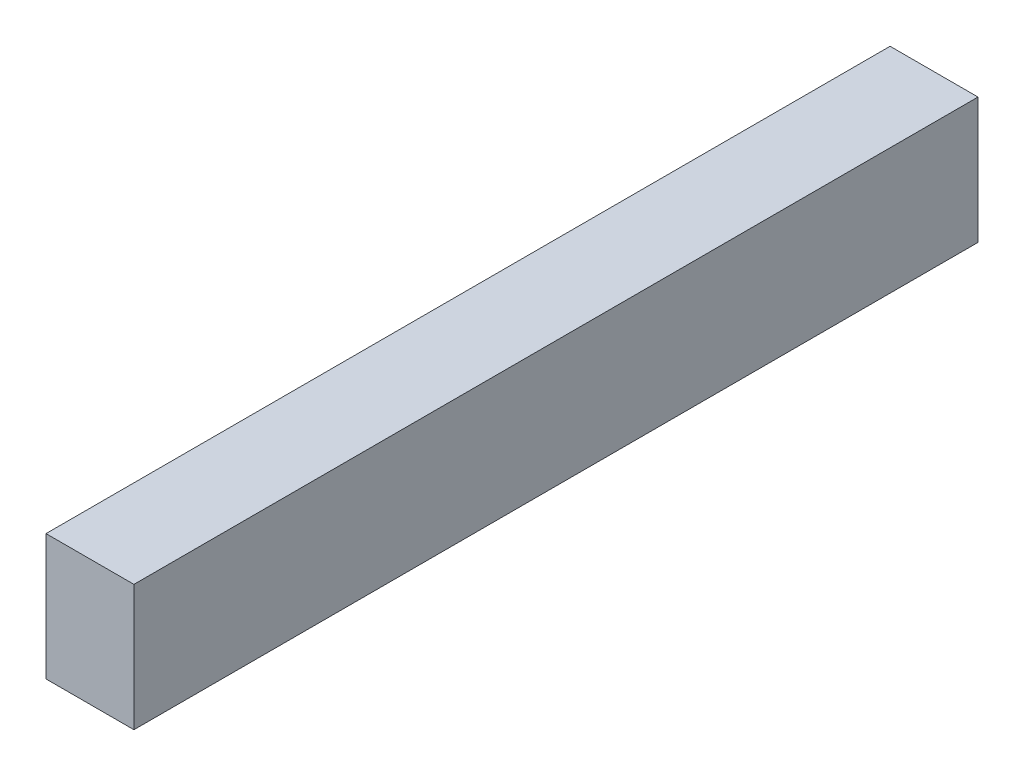
ISO-10303-21;
HEADER;
FILE_DESCRIPTION(('STEP AP214'),'2;1');
FILE_NAME('part.step','',(''),(''),'','','');
FILE_SCHEMA(('AUTOMOTIVE_DESIGN { 1 0 10303 214 1 1 1 1 }'));
ENDSEC;
DATA;
#1=APPLICATION_CONTEXT('core data for automotive mechanical design processes');
#2=APPLICATION_PROTOCOL_DEFINITION('international standard','automotive_design',2000,#1);
#3=PRODUCT_CONTEXT('',#1,'mechanical');
#4=PRODUCT('Part','Part','',(#3));
#5=PRODUCT_RELATED_PRODUCT_CATEGORY('part','',(#4));
#6=PRODUCT_DEFINITION_FORMATION('','',#4);
#7=PRODUCT_DEFINITION_CONTEXT('part definition',#1,'design');
#8=PRODUCT_DEFINITION('design','',#6,#7);
#9=PRODUCT_DEFINITION_SHAPE('','',#8);
#10=(LENGTH_UNIT() NAMED_UNIT(*) SI_UNIT(.MILLI.,.METRE.));
#11=(NAMED_UNIT(*) PLANE_ANGLE_UNIT() SI_UNIT($,.RADIAN.));
#12=(NAMED_UNIT(*) SI_UNIT($,.STERADIAN.) SOLID_ANGLE_UNIT());
#13=UNCERTAINTY_MEASURE_WITH_UNIT(LENGTH_MEASURE(1.E-05),#10,'distance_accuracy_value','');
#14=(GEOMETRIC_REPRESENTATION_CONTEXT(3) GLOBAL_UNCERTAINTY_ASSIGNED_CONTEXT((#13)) GLOBAL_UNIT_ASSIGNED_CONTEXT((#10,
#11,#12)) REPRESENTATION_CONTEXT('',''));
#15=CARTESIAN_POINT('',(0.,0.,0.));
#16=DIRECTION('',(0.,0.,1.));
#17=DIRECTION('',(1.,0.,0.));
#18=AXIS2_PLACEMENT_3D('',#15,#16,#17);
#19=CARTESIAN_POINT('',(-1.58749999999999,-2.2733,15.24));
#20=DIRECTION('',(1.,0.,0.));
#21=DIRECTION('',(0.,0.,-1.));
#22=AXIS2_PLACEMENT_3D('',#19,#20,#21);
#23=PLANE('',#22);
#24=DIRECTION('',(0.,-1.,0.));
#25=VECTOR('',#24,1.);
#26=CARTESIAN_POINT('',(-1.58749999999999,-2.2733,-15.24));
#27=LINE('',#26,#25);
#28=CARTESIAN_POINT('',(-1.58749999999999,2.2733,-15.24));
#29=VERTEX_POINT('',#28);
#30=CARTESIAN_POINT('',(-1.58749999999999,-2.2733,-15.24));
#31=VERTEX_POINT('',#30);
#32=EDGE_CURVE('E95',#29,#31,#27,.T.);
#33=ORIENTED_EDGE('',*,*,#32,.T.);
#34=DIRECTION('',(0.,0.,-1.));
#35=VECTOR('',#34,1.);
#36=CARTESIAN_POINT('',(-1.58749999999999,-2.2733,15.24));
#37=LINE('',#36,#35);
#38=CARTESIAN_POINT('',(-1.58749999999999,-2.2733,15.24));
#39=VERTEX_POINT('',#38);
#40=EDGE_CURVE('E11',#39,#31,#37,.T.);
#41=ORIENTED_EDGE('',*,*,#40,.F.);
#42=DIRECTION('',(0.,-1.,0.));
#43=VECTOR('',#42,1.);
#44=CARTESIAN_POINT('',(-1.58749999999999,-2.2733,15.24));
#45=LINE('',#44,#43);
#46=CARTESIAN_POINT('',(-1.58749999999999,2.2733,15.24));
#47=VERTEX_POINT('',#46);
#48=EDGE_CURVE('E83',#47,#39,#45,.T.);
#49=ORIENTED_EDGE('',*,*,#48,.F.);
#50=DIRECTION('',(0.,0.,-1.));
#51=VECTOR('',#50,1.);
#52=CARTESIAN_POINT('',(-1.58749999999999,2.2733,15.24));
#53=LINE('',#52,#51);
#54=EDGE_CURVE('E91',#47,#29,#53,.T.);
#55=ORIENTED_EDGE('',*,*,#54,.T.);
#56=EDGE_LOOP('',(#33,#41,#49,#55));
#57=FACE_BOUND('',#56,.T.);
#58=ADVANCED_FACE('F32',(#57),#23,.F.);
#59=CARTESIAN_POINT('',(1.58749999999999,-2.2733,15.24));
#60=DIRECTION('',(0.,1.,0.));
#61=DIRECTION('',(0.,0.,1.));
#62=AXIS2_PLACEMENT_3D('',#59,#60,#61);
#63=PLANE('',#62);
#64=DIRECTION('',(1.,0.,0.));
#65=VECTOR('',#64,1.);
#66=CARTESIAN_POINT('',(1.58749999999999,-2.2733,-15.24));
#67=LINE('',#66,#65);
#68=CARTESIAN_POINT('',(1.58749999999999,-2.2733,-15.24));
#69=VERTEX_POINT('',#68);
#70=EDGE_CURVE('E87',#31,#69,#67,.T.);
#71=ORIENTED_EDGE('',*,*,#70,.T.);
#72=DIRECTION('',(0.,0.,-1.));
#73=VECTOR('',#72,1.);
#74=CARTESIAN_POINT('',(1.58749999999999,-2.2733,15.24));
#75=LINE('',#74,#73);
#76=CARTESIAN_POINT('',(1.58749999999999,-2.2733,15.24));
#77=VERTEX_POINT('',#76);
#78=EDGE_CURVE('E40',#77,#69,#75,.T.);
#79=ORIENTED_EDGE('',*,*,#78,.F.);
#80=DIRECTION('',(1.,0.,0.));
#81=VECTOR('',#80,1.);
#82=CARTESIAN_POINT('',(1.58749999999999,-2.2733,15.24));
#83=LINE('',#82,#81);
#84=EDGE_CURVE('E78',#39,#77,#83,.T.);
#85=ORIENTED_EDGE('',*,*,#84,.F.);
#86=ORIENTED_EDGE('',*,*,#40,.T.);
#87=EDGE_LOOP('',(#71,#79,#85,#86));
#88=FACE_BOUND('',#87,.T.);
#89=ADVANCED_FACE('F86',(#88),#63,.F.);
#90=CARTESIAN_POINT('',(1.58749999999999,-2.2733,15.24));
#91=DIRECTION('',(-1.,0.,0.));
#92=DIRECTION('',(0.,-1.,0.));
#93=AXIS2_PLACEMENT_3D('',#90,#91,#92);
#94=PLANE('',#93);
#95=DIRECTION('',(0.,1.,0.));
#96=VECTOR('',#95,1.);
#97=CARTESIAN_POINT('',(1.58749999999999,-2.2733,-15.24));
#98=LINE('',#97,#96);
#99=CARTESIAN_POINT('',(1.58749999999999,2.2733,-15.24));
#100=VERTEX_POINT('',#99);
#101=EDGE_CURVE('E65',#69,#100,#98,.T.);
#102=ORIENTED_EDGE('',*,*,#101,.T.);
#103=DIRECTION('',(0.,0.,-1.));
#104=VECTOR('',#103,1.);
#105=CARTESIAN_POINT('',(1.58749999999999,2.2733,15.24));
#106=LINE('',#105,#104);
#107=CARTESIAN_POINT('',(1.58749999999999,2.2733,15.24));
#108=VERTEX_POINT('',#107);
#109=EDGE_CURVE('E88',#108,#100,#106,.T.);
#110=ORIENTED_EDGE('',*,*,#109,.F.);
#111=DIRECTION('',(0.,1.,0.));
#112=VECTOR('',#111,1.);
#113=CARTESIAN_POINT('',(1.58749999999999,-2.2733,15.24));
#114=LINE('',#113,#112);
#115=EDGE_CURVE('E81',#77,#108,#114,.T.);
#116=ORIENTED_EDGE('',*,*,#115,.F.);
#117=ORIENTED_EDGE('',*,*,#78,.T.);
#118=EDGE_LOOP('',(#102,#110,#116,#117));
#119=FACE_BOUND('',#118,.T.);
#120=ADVANCED_FACE('F89',(#119),#94,.F.);
#121=CARTESIAN_POINT('',(1.58749999999999,2.2733,15.24));
#122=DIRECTION('',(0.,-1.,0.));
#123=DIRECTION('',(1.,0.,0.));
#124=AXIS2_PLACEMENT_3D('',#121,#122,#123);
#125=PLANE('',#124);
#126=DIRECTION('',(-1.,0.,0.));
#127=VECTOR('',#126,1.);
#128=CARTESIAN_POINT('',(1.58749999999999,2.2733,-15.24));
#129=LINE('',#128,#127);
#130=EDGE_CURVE('E71',#100,#29,#129,.T.);
#131=ORIENTED_EDGE('',*,*,#130,.T.);
#132=ORIENTED_EDGE('',*,*,#54,.F.);
#133=DIRECTION('',(-1.,0.,0.));
#134=VECTOR('',#133,1.);
#135=CARTESIAN_POINT('',(1.58749999999999,2.2733,15.24));
#136=LINE('',#135,#134);
#137=EDGE_CURVE('E48',#108,#47,#136,.T.);
#138=ORIENTED_EDGE('',*,*,#137,.F.);
#139=ORIENTED_EDGE('',*,*,#109,.T.);
#140=EDGE_LOOP('',(#131,#132,#138,#139));
#141=FACE_BOUND('',#140,.T.);
#142=ADVANCED_FACE('F102',(#141),#125,.F.);
#143=CARTESIAN_POINT('',(0.,0.,15.24));
#144=DIRECTION('',(0.,0.,1.));
#145=DIRECTION('',(1.,0.,0.));
#146=AXIS2_PLACEMENT_3D('',#143,#144,#145);
#147=PLANE('',#146);
#148=ORIENTED_EDGE('',*,*,#48,.T.);
#149=ORIENTED_EDGE('',*,*,#84,.T.);
#150=ORIENTED_EDGE('',*,*,#115,.T.);
#151=ORIENTED_EDGE('',*,*,#137,.T.);
#152=EDGE_LOOP('',(#148,#149,#150,#151));
#153=FACE_BOUND('',#152,.T.);
#154=ADVANCED_FACE('F79',(#153),#147,.T.);
#155=CARTESIAN_POINT('',(0.,0.,-15.24));
#156=DIRECTION('',(0.,0.,1.));
#157=DIRECTION('',(1.,0.,0.));
#158=AXIS2_PLACEMENT_3D('',#155,#156,#157);
#159=PLANE('',#158);
#160=ORIENTED_EDGE('',*,*,#32,.F.);
#161=ORIENTED_EDGE('',*,*,#130,.F.);
#162=ORIENTED_EDGE('',*,*,#101,.F.);
#163=ORIENTED_EDGE('',*,*,#70,.F.);
#164=EDGE_LOOP('',(#160,#161,#162,#163));
#165=FACE_BOUND('',#164,.T.);
#166=ADVANCED_FACE('F105',(#165),#159,.F.);
#167=CLOSED_SHELL('',(#58,#89,#120,#142,#154,#166));
#168=MANIFOLD_SOLID_BREP('B2',#167);
#169=ADVANCED_BREP_SHAPE_REPRESENTATION('',(#18,#168),#14);
#170=SHAPE_DEFINITION_REPRESENTATION(#9,#169);
ENDSEC;
END-ISO-10303-21;
